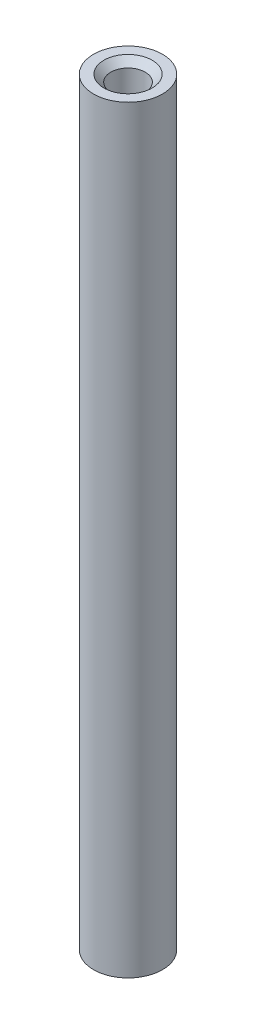
ISO-10303-21;
HEADER;
FILE_DESCRIPTION(('STEP AP214'),'2;1');
FILE_NAME('part.step','',(''),(''),'','','');
FILE_SCHEMA(('AUTOMOTIVE_DESIGN { 1 0 10303 214 1 1 1 1 }'));
ENDSEC;
DATA;
#1=APPLICATION_CONTEXT('core data for automotive mechanical design processes');
#2=APPLICATION_PROTOCOL_DEFINITION('international standard','automotive_design',2000,#1);
#3=PRODUCT_CONTEXT('',#1,'mechanical');
#4=PRODUCT('Part','Part','',(#3));
#5=PRODUCT_RELATED_PRODUCT_CATEGORY('part','',(#4));
#6=PRODUCT_DEFINITION_FORMATION('','',#4);
#7=PRODUCT_DEFINITION_CONTEXT('part definition',#1,'design');
#8=PRODUCT_DEFINITION('design','',#6,#7);
#9=PRODUCT_DEFINITION_SHAPE('','',#8);
#10=(LENGTH_UNIT() NAMED_UNIT(*) SI_UNIT(.MILLI.,.METRE.));
#11=(NAMED_UNIT(*) PLANE_ANGLE_UNIT() SI_UNIT($,.RADIAN.));
#12=(NAMED_UNIT(*) SI_UNIT($,.STERADIAN.) SOLID_ANGLE_UNIT());
#13=UNCERTAINTY_MEASURE_WITH_UNIT(LENGTH_MEASURE(1.E-05),#10,'distance_accuracy_value','');
#14=(GEOMETRIC_REPRESENTATION_CONTEXT(3) GLOBAL_UNCERTAINTY_ASSIGNED_CONTEXT((#13)) GLOBAL_UNIT_ASSIGNED_CONTEXT((#10,
#11,#12)) REPRESENTATION_CONTEXT('',''));
#15=CARTESIAN_POINT('',(0.,0.,0.));
#16=DIRECTION('',(0.,0.,1.));
#17=DIRECTION('',(1.,0.,0.));
#18=AXIS2_PLACEMENT_3D('',#15,#16,#17);
#19=CARTESIAN_POINT('',(0.,55.,0.));
#20=DIRECTION('',(0.,1.,0.));
#21=DIRECTION('',(0.,0.,1.));
#22=AXIS2_PLACEMENT_3D('',#19,#20,#21);
#23=CYLINDRICAL_SURFACE('',#22,1.24999999999999);
#24=CARTESIAN_POINT('',(0.,0.50000000004502,0.));
#25=DIRECTION('',(0.,-1.,0.));
#26=DIRECTION('',(0.,0.,-1.));
#27=AXIS2_PLACEMENT_3D('',#24,#25,#26);
#28=CIRCLE('',#27,1.24999999997044);
#29=CARTESIAN_POINT('',(0.,0.50000000004502,-1.24999999997044));
#30=VERTEX_POINT('',#29);
#31=EDGE_CURVE('E41',#30,#30,#28,.T.);
#32=ORIENTED_EDGE('',*,*,#31,.T.);
#33=EDGE_LOOP('',(#32));
#34=FACE_BOUND('',#33,.T.);
#35=CARTESIAN_POINT('',(0.,54.4999999999618,0.));
#36=DIRECTION('',(0.,1.,0.));
#37=DIRECTION('',(0.,0.,1.));
#38=AXIS2_PLACEMENT_3D('',#35,#36,#37);
#39=CIRCLE('',#38,1.25000000002728);
#40=CARTESIAN_POINT('',(0.,54.4999999999618,1.25000000002728));
#41=VERTEX_POINT('',#40);
#42=EDGE_CURVE('E45',#41,#41,#39,.T.);
#43=ORIENTED_EDGE('',*,*,#42,.T.);
#44=EDGE_LOOP('',(#43));
#45=FACE_BOUND('',#44,.T.);
#46=ADVANCED_FACE('F14',(#34,#45),#23,.F.);
#47=CARTESIAN_POINT('',(0.,54.9999999998931,0.));
#48=DIRECTION('',(0.,1.,0.));
#49=DIRECTION('',(-1.,0.,0.));
#50=AXIS2_PLACEMENT_3D('',#47,#48,#49);
#51=CONICAL_SURFACE('',#50,1.74999999995862,0.785398163397448);
#52=ORIENTED_EDGE('',*,*,#42,.F.);
#53=EDGE_LOOP('',(#52));
#54=FACE_BOUND('',#53,.T.);
#55=CARTESIAN_POINT('',(0.,54.99999999995,0.));
#56=DIRECTION('',(0.,1.,0.));
#57=DIRECTION('',(-1.,0.,0.));
#58=AXIS2_PLACEMENT_3D('',#55,#56,#57);
#59=CIRCLE('',#58,1.75000000001546);
#60=CARTESIAN_POINT('',(-1.75000000001546,54.99999999995,0.));
#61=VERTEX_POINT('',#60);
#62=EDGE_CURVE('E38',#61,#61,#59,.F.);
#63=ORIENTED_EDGE('',*,*,#62,.F.);
#64=EDGE_LOOP('',(#63));
#65=FACE_BOUND('',#64,.T.);
#66=ADVANCED_FACE('F55',(#54,#65),#51,.F.);
#67=CARTESIAN_POINT('',(0.,0.,0.));
#68=DIRECTION('',(0.,-1.,0.));
#69=DIRECTION('',(0.,0.,-1.));
#70=AXIS2_PLACEMENT_3D('',#67,#68,#69);
#71=CONICAL_SURFACE('',#70,1.75000000001546,0.785398163397448);
#72=CARTESIAN_POINT('',(0.,0.,0.));
#73=DIRECTION('',(0.,-1.,0.));
#74=DIRECTION('',(0.,0.,-1.));
#75=AXIS2_PLACEMENT_3D('',#72,#73,#74);
#76=CIRCLE('',#75,1.75000000001546);
#77=CARTESIAN_POINT('',(0.,0.,-1.75000000001546));
#78=VERTEX_POINT('',#77);
#79=EDGE_CURVE('E26',#78,#78,#76,.T.);
#80=ORIENTED_EDGE('',*,*,#79,.T.);
#81=EDGE_LOOP('',(#80));
#82=FACE_BOUND('',#81,.T.);
#83=ORIENTED_EDGE('',*,*,#31,.F.);
#84=EDGE_LOOP('',(#83));
#85=FACE_BOUND('',#84,.T.);
#86=ADVANCED_FACE('F58',(#82,#85),#71,.F.);
#87=CARTESIAN_POINT('',(0.,55.,0.));
#88=DIRECTION('',(0.,1.,0.));
#89=DIRECTION('',(0.,0.,1.));
#90=AXIS2_PLACEMENT_3D('',#87,#88,#89);
#91=PLANE('',#90);
#92=CARTESIAN_POINT('',(0.,55.,0.));
#93=DIRECTION('',(0.,-1.,0.));
#94=DIRECTION('',(0.,0.,-1.));
#95=AXIS2_PLACEMENT_3D('',#92,#93,#94);
#96=CIRCLE('',#95,2.5);
#97=CARTESIAN_POINT('',(0.,55.,-2.5));
#98=VERTEX_POINT('',#97);
#99=EDGE_CURVE('E21',#98,#98,#96,.T.);
#100=ORIENTED_EDGE('',*,*,#99,.F.);
#101=EDGE_LOOP('',(#100));
#102=FACE_BOUND('',#101,.T.);
#103=ORIENTED_EDGE('',*,*,#62,.T.);
#104=EDGE_LOOP('',(#103));
#105=FACE_BOUND('',#104,.T.);
#106=ADVANCED_FACE('F64',(#102,#105),#91,.T.);
#107=CARTESIAN_POINT('',(0.,0.,0.));
#108=DIRECTION('',(0.,1.,0.));
#109=DIRECTION('',(0.,0.,1.));
#110=AXIS2_PLACEMENT_3D('',#107,#108,#109);
#111=PLANE('',#110);
#112=CARTESIAN_POINT('',(0.,0.,0.));
#113=DIRECTION('',(0.,-1.,0.));
#114=DIRECTION('',(0.,0.,-1.));
#115=AXIS2_PLACEMENT_3D('',#112,#113,#114);
#116=CIRCLE('',#115,2.5);
#117=CARTESIAN_POINT('',(0.,0.,-2.5));
#118=VERTEX_POINT('',#117);
#119=EDGE_CURVE('E10',#118,#118,#116,.F.);
#120=ORIENTED_EDGE('',*,*,#119,.F.);
#121=EDGE_LOOP('',(#120));
#122=FACE_BOUND('',#121,.T.);
#123=ORIENTED_EDGE('',*,*,#79,.F.);
#124=EDGE_LOOP('',(#123));
#125=FACE_BOUND('',#124,.T.);
#126=ADVANCED_FACE('F70',(#122,#125),#111,.F.);
#127=CARTESIAN_POINT('',(0.,55.,0.));
#128=DIRECTION('',(0.,-1.,0.));
#129=DIRECTION('',(0.,0.,-1.));
#130=AXIS2_PLACEMENT_3D('',#127,#128,#129);
#131=CYLINDRICAL_SURFACE('',#130,2.5);
#132=ORIENTED_EDGE('',*,*,#119,.T.);
#133=EDGE_LOOP('',(#132));
#134=FACE_BOUND('',#133,.T.);
#135=ORIENTED_EDGE('',*,*,#99,.T.);
#136=EDGE_LOOP('',(#135));
#137=FACE_BOUND('',#136,.T.);
#138=ADVANCED_FACE('F68',(#134,#137),#131,.T.);
#139=CLOSED_SHELL('',(#46,#66,#86,#106,#126,#138));
#140=MANIFOLD_SOLID_BREP('B1',#139);
#141=ADVANCED_BREP_SHAPE_REPRESENTATION('',(#18,#140),#14);
#142=SHAPE_DEFINITION_REPRESENTATION(#9,#141);
ENDSEC;
END-ISO-10303-21;
